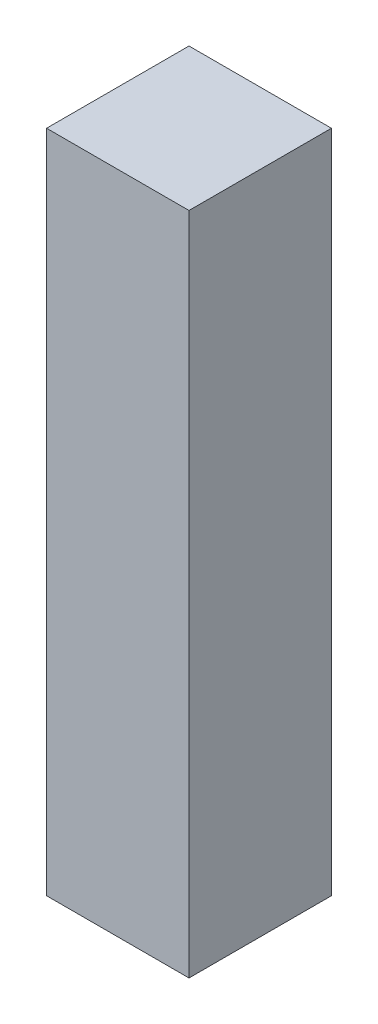
ISO-10303-21;
HEADER;
FILE_DESCRIPTION(('STEP AP214'),'2;1');
FILE_NAME('part.step','',(''),(''),'','','');
FILE_SCHEMA(('AUTOMOTIVE_DESIGN { 1 0 10303 214 1 1 1 1 }'));
ENDSEC;
DATA;
#1=APPLICATION_CONTEXT('core data for automotive mechanical design processes');
#2=APPLICATION_PROTOCOL_DEFINITION('international standard','automotive_design',2000,#1);
#3=PRODUCT_CONTEXT('',#1,'mechanical');
#4=PRODUCT('Part','Part','',(#3));
#5=PRODUCT_RELATED_PRODUCT_CATEGORY('part','',(#4));
#6=PRODUCT_DEFINITION_FORMATION('','',#4);
#7=PRODUCT_DEFINITION_CONTEXT('part definition',#1,'design');
#8=PRODUCT_DEFINITION('design','',#6,#7);
#9=PRODUCT_DEFINITION_SHAPE('','',#8);
#10=(LENGTH_UNIT() NAMED_UNIT(*) SI_UNIT(.MILLI.,.METRE.));
#11=(NAMED_UNIT(*) PLANE_ANGLE_UNIT() SI_UNIT($,.RADIAN.));
#12=(NAMED_UNIT(*) SI_UNIT($,.STERADIAN.) SOLID_ANGLE_UNIT());
#13=UNCERTAINTY_MEASURE_WITH_UNIT(LENGTH_MEASURE(1.E-05),#10,'distance_accuracy_value','');
#14=(GEOMETRIC_REPRESENTATION_CONTEXT(3) GLOBAL_UNCERTAINTY_ASSIGNED_CONTEXT((#13)) GLOBAL_UNIT_ASSIGNED_CONTEXT((#10,
#11,#12)) REPRESENTATION_CONTEXT('',''));
#15=CARTESIAN_POINT('',(0.,0.,0.));
#16=DIRECTION('',(0.,0.,1.));
#17=DIRECTION('',(1.,0.,0.));
#18=AXIS2_PLACEMENT_3D('',#15,#16,#17);
#19=CARTESIAN_POINT('',(0.,70.,0.));
#20=DIRECTION('',(1.,0.,0.));
#21=DIRECTION('',(0.,0.,-1.));
#22=AXIS2_PLACEMENT_3D('',#19,#20,#21);
#23=PLANE('',#22);
#24=DIRECTION('',(0.,0.,1.));
#25=VECTOR('',#24,1.);
#26=CARTESIAN_POINT('',(0.,0.,0.));
#27=LINE('',#26,#25);
#28=CARTESIAN_POINT('',(0.,0.,-15.));
#29=VERTEX_POINT('',#28);
#30=CARTESIAN_POINT('',(0.,0.,0.));
#31=VERTEX_POINT('',#30);
#32=EDGE_CURVE('E102',#29,#31,#27,.T.);
#33=ORIENTED_EDGE('',*,*,#32,.T.);
#34=DIRECTION('',(0.,-1.,0.));
#35=VECTOR('',#34,1.);
#36=CARTESIAN_POINT('',(0.,70.,0.));
#37=LINE('',#36,#35);
#38=CARTESIAN_POINT('',(0.,70.,0.));
#39=VERTEX_POINT('',#38);
#40=EDGE_CURVE('E11',#39,#31,#37,.T.);
#41=ORIENTED_EDGE('',*,*,#40,.F.);
#42=DIRECTION('',(0.,0.,1.));
#43=VECTOR('',#42,1.);
#44=CARTESIAN_POINT('',(0.,70.,0.));
#45=LINE('',#44,#43);
#46=CARTESIAN_POINT('',(0.,70.,-15.));
#47=VERTEX_POINT('',#46);
#48=EDGE_CURVE('E90',#47,#39,#45,.T.);
#49=ORIENTED_EDGE('',*,*,#48,.F.);
#50=DIRECTION('',(0.,-1.,0.));
#51=VECTOR('',#50,1.);
#52=CARTESIAN_POINT('',(0.,70.,-15.));
#53=LINE('',#52,#51);
#54=EDGE_CURVE('E98',#47,#29,#53,.T.);
#55=ORIENTED_EDGE('',*,*,#54,.T.);
#56=EDGE_LOOP('',(#33,#41,#49,#55));
#57=FACE_BOUND('',#56,.T.);
#58=ADVANCED_FACE('F39',(#57),#23,.F.);
#59=CARTESIAN_POINT('',(0.,70.,0.));
#60=DIRECTION('',(0.,0.,-1.));
#61=DIRECTION('',(-1.,0.,0.));
#62=AXIS2_PLACEMENT_3D('',#59,#60,#61);
#63=PLANE('',#62);
#64=DIRECTION('',(1.,0.,0.));
#65=VECTOR('',#64,1.);
#66=CARTESIAN_POINT('',(0.,0.,0.));
#67=LINE('',#66,#65);
#68=CARTESIAN_POINT('',(15.,0.,0.));
#69=VERTEX_POINT('',#68);
#70=EDGE_CURVE('E94',#31,#69,#67,.T.);
#71=ORIENTED_EDGE('',*,*,#70,.T.);
#72=DIRECTION('',(0.,-1.,0.));
#73=VECTOR('',#72,1.);
#74=CARTESIAN_POINT('',(15.,70.,0.));
#75=LINE('',#74,#73);
#76=CARTESIAN_POINT('',(15.,70.,0.));
#77=VERTEX_POINT('',#76);
#78=EDGE_CURVE('E47',#77,#69,#75,.T.);
#79=ORIENTED_EDGE('',*,*,#78,.F.);
#80=DIRECTION('',(1.,0.,0.));
#81=VECTOR('',#80,1.);
#82=CARTESIAN_POINT('',(0.,70.,0.));
#83=LINE('',#82,#81);
#84=EDGE_CURVE('E85',#39,#77,#83,.T.);
#85=ORIENTED_EDGE('',*,*,#84,.F.);
#86=ORIENTED_EDGE('',*,*,#40,.T.);
#87=EDGE_LOOP('',(#71,#79,#85,#86));
#88=FACE_BOUND('',#87,.T.);
#89=ADVANCED_FACE('F93',(#88),#63,.F.);
#90=CARTESIAN_POINT('',(15.,70.,0.));
#91=DIRECTION('',(-1.,0.,0.));
#92=DIRECTION('',(0.,0.,1.));
#93=AXIS2_PLACEMENT_3D('',#90,#91,#92);
#94=PLANE('',#93);
#95=DIRECTION('',(0.,0.,-1.));
#96=VECTOR('',#95,1.);
#97=CARTESIAN_POINT('',(15.,0.,0.));
#98=LINE('',#97,#96);
#99=CARTESIAN_POINT('',(15.,0.,-15.));
#100=VERTEX_POINT('',#99);
#101=EDGE_CURVE('E72',#69,#100,#98,.T.);
#102=ORIENTED_EDGE('',*,*,#101,.T.);
#103=DIRECTION('',(0.,-1.,0.));
#104=VECTOR('',#103,1.);
#105=CARTESIAN_POINT('',(15.,70.,-15.));
#106=LINE('',#105,#104);
#107=CARTESIAN_POINT('',(15.,70.,-15.));
#108=VERTEX_POINT('',#107);
#109=EDGE_CURVE('E95',#108,#100,#106,.T.);
#110=ORIENTED_EDGE('',*,*,#109,.F.);
#111=DIRECTION('',(0.,0.,-1.));
#112=VECTOR('',#111,1.);
#113=CARTESIAN_POINT('',(15.,70.,0.));
#114=LINE('',#113,#112);
#115=EDGE_CURVE('E88',#77,#108,#114,.T.);
#116=ORIENTED_EDGE('',*,*,#115,.F.);
#117=ORIENTED_EDGE('',*,*,#78,.T.);
#118=EDGE_LOOP('',(#102,#110,#116,#117));
#119=FACE_BOUND('',#118,.T.);
#120=ADVANCED_FACE('F96',(#119),#94,.F.);
#121=CARTESIAN_POINT('',(0.,70.,-15.));
#122=DIRECTION('',(0.,0.,1.));
#123=DIRECTION('',(1.,0.,0.));
#124=AXIS2_PLACEMENT_3D('',#121,#122,#123);
#125=PLANE('',#124);
#126=DIRECTION('',(-1.,0.,0.));
#127=VECTOR('',#126,1.);
#128=CARTESIAN_POINT('',(0.,0.,-15.));
#129=LINE('',#128,#127);
#130=EDGE_CURVE('E78',#100,#29,#129,.T.);
#131=ORIENTED_EDGE('',*,*,#130,.T.);
#132=ORIENTED_EDGE('',*,*,#54,.F.);
#133=DIRECTION('',(-1.,0.,0.));
#134=VECTOR('',#133,1.);
#135=CARTESIAN_POINT('',(0.,70.,-15.));
#136=LINE('',#135,#134);
#137=EDGE_CURVE('E55',#108,#47,#136,.T.);
#138=ORIENTED_EDGE('',*,*,#137,.F.);
#139=ORIENTED_EDGE('',*,*,#109,.T.);
#140=EDGE_LOOP('',(#131,#132,#138,#139));
#141=FACE_BOUND('',#140,.T.);
#142=ADVANCED_FACE('F109',(#141),#125,.F.);
#143=CARTESIAN_POINT('',(0.,70.,0.));
#144=DIRECTION('',(0.,-1.,0.));
#145=DIRECTION('',(0.,0.,-1.));
#146=AXIS2_PLACEMENT_3D('',#143,#144,#145);
#147=PLANE('',#146);
#148=ORIENTED_EDGE('',*,*,#48,.T.);
#149=ORIENTED_EDGE('',*,*,#84,.T.);
#150=ORIENTED_EDGE('',*,*,#115,.T.);
#151=ORIENTED_EDGE('',*,*,#137,.T.);
#152=EDGE_LOOP('',(#148,#149,#150,#151));
#153=FACE_BOUND('',#152,.T.);
#154=ADVANCED_FACE('F86',(#153),#147,.F.);
#155=CARTESIAN_POINT('',(0.,0.,0.));
#156=DIRECTION('',(0.,-1.,0.));
#157=DIRECTION('',(0.,0.,-1.));
#158=AXIS2_PLACEMENT_3D('',#155,#156,#157);
#159=PLANE('',#158);
#160=ORIENTED_EDGE('',*,*,#32,.F.);
#161=ORIENTED_EDGE('',*,*,#130,.F.);
#162=ORIENTED_EDGE('',*,*,#101,.F.);
#163=ORIENTED_EDGE('',*,*,#70,.F.);
#164=EDGE_LOOP('',(#160,#161,#162,#163));
#165=FACE_BOUND('',#164,.T.);
#166=ADVANCED_FACE('F112',(#165),#159,.T.);
#167=CLOSED_SHELL('',(#58,#89,#120,#142,#154,#166));
#168=MANIFOLD_SOLID_BREP('B2',#167);
#169=ADVANCED_BREP_SHAPE_REPRESENTATION('',(#18,#168),#14);
#170=SHAPE_DEFINITION_REPRESENTATION(#9,#169);
ENDSEC;
END-ISO-10303-21;
